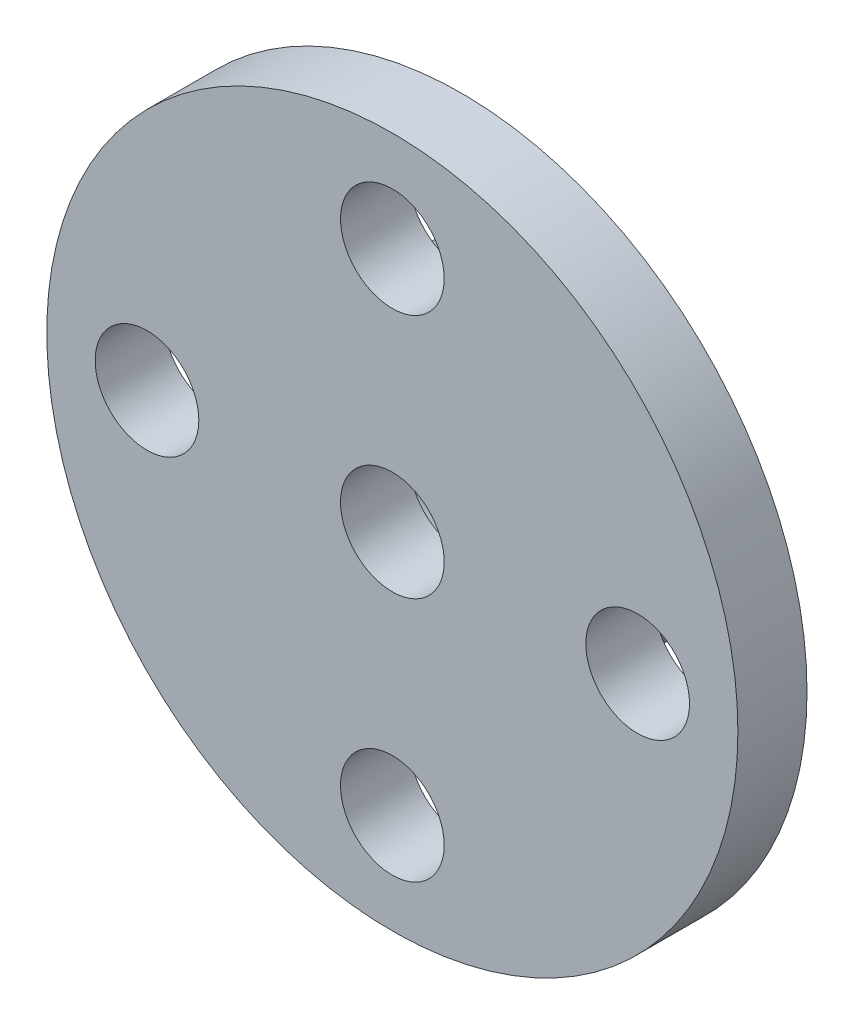
ISO-10303-21;
HEADER;
FILE_DESCRIPTION(('STEP AP214'),'2;1');
FILE_NAME('part.step','',(''),(''),'','','');
FILE_SCHEMA(('AUTOMOTIVE_DESIGN { 1 0 10303 214 1 1 1 1 }'));
ENDSEC;
DATA;
#1=APPLICATION_CONTEXT('core data for automotive mechanical design processes');
#2=APPLICATION_PROTOCOL_DEFINITION('international standard','automotive_design',2000,#1);
#3=PRODUCT_CONTEXT('',#1,'mechanical');
#4=PRODUCT('Part','Part','',(#3));
#5=PRODUCT_RELATED_PRODUCT_CATEGORY('part','',(#4));
#6=PRODUCT_DEFINITION_FORMATION('','',#4);
#7=PRODUCT_DEFINITION_CONTEXT('part definition',#1,'design');
#8=PRODUCT_DEFINITION('design','',#6,#7);
#9=PRODUCT_DEFINITION_SHAPE('','',#8);
#10=(LENGTH_UNIT() NAMED_UNIT(*) SI_UNIT(.MILLI.,.METRE.));
#11=(NAMED_UNIT(*) PLANE_ANGLE_UNIT() SI_UNIT($,.RADIAN.));
#12=(NAMED_UNIT(*) SI_UNIT($,.STERADIAN.) SOLID_ANGLE_UNIT());
#13=UNCERTAINTY_MEASURE_WITH_UNIT(LENGTH_MEASURE(1.E-05),#10,'distance_accuracy_value','');
#14=(GEOMETRIC_REPRESENTATION_CONTEXT(3) GLOBAL_UNCERTAINTY_ASSIGNED_CONTEXT((#13)) GLOBAL_UNIT_ASSIGNED_CONTEXT((#10,
#11,#12)) REPRESENTATION_CONTEXT('',''));
#15=CARTESIAN_POINT('',(0.,0.,0.));
#16=DIRECTION('',(0.,0.,1.));
#17=DIRECTION('',(1.,0.,0.));
#18=AXIS2_PLACEMENT_3D('',#15,#16,#17);
#19=CARTESIAN_POINT('',(0.,0.,-2.));
#20=DIRECTION('',(0.,0.,1.));
#21=DIRECTION('',(1.,0.,0.));
#22=AXIS2_PLACEMENT_3D('',#19,#20,#21);
#23=PLANE('',#22);
#24=CARTESIAN_POINT('',(0.,0.,-2.));
#25=DIRECTION('',(0.,0.,1.));
#26=DIRECTION('',(1.,0.,0.));
#27=AXIS2_PLACEMENT_3D('',#24,#25,#26);
#28=CIRCLE('',#27,1.5);
#29=CARTESIAN_POINT('',(1.5,0.,-2.));
#30=VERTEX_POINT('',#29);
#31=EDGE_CURVE('E49',#30,#30,#28,.F.);
#32=ORIENTED_EDGE('',*,*,#31,.F.);
#33=EDGE_LOOP('',(#32));
#34=FACE_BOUND('',#33,.T.);
#35=CARTESIAN_POINT('',(0.,0.,-2.));
#36=DIRECTION('',(0.,0.,-1.));
#37=DIRECTION('',(-1.,0.,0.));
#38=AXIS2_PLACEMENT_3D('',#35,#36,#37);
#39=CIRCLE('',#38,3.);
#40=CARTESIAN_POINT('',(-3.,0.,-2.));
#41=VERTEX_POINT('',#40);
#42=EDGE_CURVE('E84',#41,#41,#39,.T.);
#43=ORIENTED_EDGE('',*,*,#42,.T.);
#44=EDGE_LOOP('',(#43));
#45=FACE_BOUND('',#44,.T.);
#46=ADVANCED_FACE('F33',(#34,#45),#23,.F.);
#47=CARTESIAN_POINT('',(0.,0.,-2.));
#48=DIRECTION('',(0.,0.,1.));
#49=DIRECTION('',(1.,0.,0.));
#50=AXIS2_PLACEMENT_3D('',#47,#48,#49);
#51=CYLINDRICAL_SURFACE('',#50,10.);
#52=CARTESIAN_POINT('',(0.,0.,-2.));
#53=DIRECTION('',(0.,0.,1.));
#54=DIRECTION('',(1.,0.,0.));
#55=AXIS2_PLACEMENT_3D('',#52,#53,#54);
#56=CIRCLE('',#55,10.);
#57=CARTESIAN_POINT('',(10.,0.,-2.));
#58=VERTEX_POINT('',#57);
#59=EDGE_CURVE('E40',#58,#58,#56,.T.);
#60=ORIENTED_EDGE('',*,*,#59,.T.);
#61=EDGE_LOOP('',(#60));
#62=FACE_BOUND('',#61,.T.);
#63=CARTESIAN_POINT('',(0.,0.,0.));
#64=DIRECTION('',(0.,0.,1.));
#65=DIRECTION('',(1.,0.,0.));
#66=AXIS2_PLACEMENT_3D('',#63,#64,#65);
#67=CIRCLE('',#66,10.);
#68=CARTESIAN_POINT('',(10.,0.,0.));
#69=VERTEX_POINT('',#68);
#70=EDGE_CURVE('E44',#69,#69,#67,.T.);
#71=ORIENTED_EDGE('',*,*,#70,.F.);
#72=EDGE_LOOP('',(#71));
#73=FACE_BOUND('',#72,.T.);
#74=ADVANCED_FACE('F35',(#62,#73),#51,.T.);
#75=CARTESIAN_POINT('',(0.,0.,-2.));
#76=DIRECTION('',(0.,0.,1.));
#77=DIRECTION('',(1.,0.,0.));
#78=AXIS2_PLACEMENT_3D('',#75,#76,#77);
#79=CIRCLE('',#78,4.75);
#80=CARTESIAN_POINT('',(4.75,0.,-2.));
#81=VERTEX_POINT('',#80);
#82=EDGE_CURVE('E10',#81,#81,#79,.F.);
#83=ORIENTED_EDGE('',*,*,#82,.F.);
#84=EDGE_LOOP('',(#83));
#85=FACE_BOUND('',#84,.T.);
#86=CARTESIAN_POINT('',(0.,-7.1,-2.));
#87=DIRECTION('',(0.,0.,1.));
#88=DIRECTION('',(1.,0.,0.));
#89=AXIS2_PLACEMENT_3D('',#86,#87,#88);
#90=CIRCLE('',#89,1.50000000000002);
#91=CARTESIAN_POINT('',(1.50000000000002,-7.1,-2.));
#92=VERTEX_POINT('',#91);
#93=EDGE_CURVE('E69',#92,#92,#90,.F.);
#94=ORIENTED_EDGE('',*,*,#93,.F.);
#95=EDGE_LOOP('',(#94));
#96=FACE_BOUND('',#95,.T.);
#97=CARTESIAN_POINT('',(7.1,0.,-2.));
#98=DIRECTION('',(0.,0.,1.));
#99=DIRECTION('',(1.,0.,0.));
#100=AXIS2_PLACEMENT_3D('',#97,#98,#99);
#101=CIRCLE('',#100,1.5);
#102=CARTESIAN_POINT('',(8.6,0.,-2.));
#103=VERTEX_POINT('',#102);
#104=EDGE_CURVE('E64',#103,#103,#101,.F.);
#105=ORIENTED_EDGE('',*,*,#104,.F.);
#106=EDGE_LOOP('',(#105));
#107=FACE_BOUND('',#106,.T.);
#108=CARTESIAN_POINT('',(0.,7.1,-2.));
#109=DIRECTION('',(0.,0.,1.));
#110=DIRECTION('',(1.,0.,0.));
#111=AXIS2_PLACEMENT_3D('',#108,#109,#110);
#112=CIRCLE('',#111,1.50000000000001);
#113=CARTESIAN_POINT('',(1.50000000000001,7.1,-2.));
#114=VERTEX_POINT('',#113);
#115=EDGE_CURVE('E57',#114,#114,#112,.F.);
#116=ORIENTED_EDGE('',*,*,#115,.F.);
#117=EDGE_LOOP('',(#116));
#118=FACE_BOUND('',#117,.T.);
#119=CARTESIAN_POINT('',(-7.1,0.,-2.));
#120=DIRECTION('',(0.,0.,1.));
#121=DIRECTION('',(1.,0.,0.));
#122=AXIS2_PLACEMENT_3D('',#119,#120,#121);
#123=CIRCLE('',#122,1.5);
#124=CARTESIAN_POINT('',(-5.6,0.,-2.));
#125=VERTEX_POINT('',#124);
#126=EDGE_CURVE('E56',#125,#125,#123,.F.);
#127=ORIENTED_EDGE('',*,*,#126,.F.);
#128=EDGE_LOOP('',(#127));
#129=FACE_BOUND('',#128,.T.);
#130=ORIENTED_EDGE('',*,*,#59,.F.);
#131=EDGE_LOOP('',(#130));
#132=FACE_BOUND('',#131,.T.);
#133=ADVANCED_FACE('F112',(#85,#96,#107,#118,#129,#132),#23,.F.);
#134=CARTESIAN_POINT('',(0.,0.,0.));
#135=DIRECTION('',(0.,0.,1.));
#136=DIRECTION('',(1.,0.,0.));
#137=AXIS2_PLACEMENT_3D('',#134,#135,#136);
#138=PLANE('',#137);
#139=CARTESIAN_POINT('',(0.,-7.1,0.));
#140=DIRECTION('',(0.,0.,1.));
#141=DIRECTION('',(1.,0.,0.));
#142=AXIS2_PLACEMENT_3D('',#139,#140,#141);
#143=CIRCLE('',#142,1.50000000000002);
#144=CARTESIAN_POINT('',(1.50000000000002,-7.1,0.));
#145=VERTEX_POINT('',#144);
#146=EDGE_CURVE('E73',#145,#145,#143,.T.);
#147=ORIENTED_EDGE('',*,*,#146,.F.);
#148=EDGE_LOOP('',(#147));
#149=FACE_BOUND('',#148,.T.);
#150=CARTESIAN_POINT('',(7.1,0.,0.));
#151=DIRECTION('',(0.,0.,1.));
#152=DIRECTION('',(1.,0.,0.));
#153=AXIS2_PLACEMENT_3D('',#150,#151,#152);
#154=CIRCLE('',#153,1.5);
#155=CARTESIAN_POINT('',(8.6,0.,0.));
#156=VERTEX_POINT('',#155);
#157=EDGE_CURVE('E72',#156,#156,#154,.T.);
#158=ORIENTED_EDGE('',*,*,#157,.F.);
#159=EDGE_LOOP('',(#158));
#160=FACE_BOUND('',#159,.T.);
#161=CARTESIAN_POINT('',(0.,7.1,0.));
#162=DIRECTION('',(0.,0.,1.));
#163=DIRECTION('',(1.,0.,0.));
#164=AXIS2_PLACEMENT_3D('',#161,#162,#163);
#165=CIRCLE('',#164,1.50000000000001);
#166=CARTESIAN_POINT('',(1.50000000000001,7.1,0.));
#167=VERTEX_POINT('',#166);
#168=EDGE_CURVE('E61',#167,#167,#165,.T.);
#169=ORIENTED_EDGE('',*,*,#168,.F.);
#170=EDGE_LOOP('',(#169));
#171=FACE_BOUND('',#170,.T.);
#172=CARTESIAN_POINT('',(-7.1,0.,0.));
#173=DIRECTION('',(0.,0.,1.));
#174=DIRECTION('',(1.,0.,0.));
#175=AXIS2_PLACEMENT_3D('',#172,#173,#174);
#176=CIRCLE('',#175,1.5);
#177=CARTESIAN_POINT('',(-5.6,0.,0.));
#178=VERTEX_POINT('',#177);
#179=EDGE_CURVE('E60',#178,#178,#176,.T.);
#180=ORIENTED_EDGE('',*,*,#179,.F.);
#181=EDGE_LOOP('',(#180));
#182=FACE_BOUND('',#181,.T.);
#183=CARTESIAN_POINT('',(0.,0.,0.));
#184=DIRECTION('',(0.,0.,1.));
#185=DIRECTION('',(1.,0.,0.));
#186=AXIS2_PLACEMENT_3D('',#183,#184,#185);
#187=CIRCLE('',#186,1.5);
#188=CARTESIAN_POINT('',(1.5,0.,0.));
#189=VERTEX_POINT('',#188);
#190=EDGE_CURVE('E53',#189,#189,#187,.T.);
#191=ORIENTED_EDGE('',*,*,#190,.F.);
#192=EDGE_LOOP('',(#191));
#193=FACE_BOUND('',#192,.T.);
#194=ORIENTED_EDGE('',*,*,#70,.T.);
#195=EDGE_LOOP('',(#194));
#196=FACE_BOUND('',#195,.T.);
#197=ADVANCED_FACE('F120',(#149,#160,#171,#182,#193,#196),#138,.T.);
#198=CARTESIAN_POINT('',(0.,0.,-2.001));
#199=DIRECTION('',(0.,0.,1.));
#200=DIRECTION('',(1.,0.,0.));
#201=AXIS2_PLACEMENT_3D('',#198,#199,#200);
#202=CYLINDRICAL_SURFACE('',#201,1.5);
#203=ORIENTED_EDGE('',*,*,#190,.T.);
#204=EDGE_LOOP('',(#203));
#205=FACE_BOUND('',#204,.T.);
#206=ORIENTED_EDGE('',*,*,#31,.T.);
#207=EDGE_LOOP('',(#206));
#208=FACE_BOUND('',#207,.T.);
#209=ADVANCED_FACE('F125',(#205,#208),#202,.F.);
#210=CARTESIAN_POINT('',(-7.1,0.,-2.001));
#211=DIRECTION('',(0.,0.,1.));
#212=DIRECTION('',(1.,0.,0.));
#213=AXIS2_PLACEMENT_3D('',#210,#211,#212);
#214=CYLINDRICAL_SURFACE('',#213,1.5);
#215=ORIENTED_EDGE('',*,*,#179,.T.);
#216=EDGE_LOOP('',(#215));
#217=FACE_BOUND('',#216,.T.);
#218=ORIENTED_EDGE('',*,*,#126,.T.);
#219=EDGE_LOOP('',(#218));
#220=FACE_BOUND('',#219,.T.);
#221=ADVANCED_FACE('F137',(#217,#220),#214,.F.);
#222=CARTESIAN_POINT('',(0.,7.1,-2.001));
#223=DIRECTION('',(0.,0.,1.));
#224=DIRECTION('',(1.,0.,0.));
#225=AXIS2_PLACEMENT_3D('',#222,#223,#224);
#226=CYLINDRICAL_SURFACE('',#225,1.50000000000001);
#227=ORIENTED_EDGE('',*,*,#168,.T.);
#228=EDGE_LOOP('',(#227));
#229=FACE_BOUND('',#228,.T.);
#230=ORIENTED_EDGE('',*,*,#115,.T.);
#231=EDGE_LOOP('',(#230));
#232=FACE_BOUND('',#231,.T.);
#233=ADVANCED_FACE('F139',(#229,#232),#226,.F.);
#234=CARTESIAN_POINT('',(7.1,0.,-2.001));
#235=DIRECTION('',(0.,0.,1.));
#236=DIRECTION('',(1.,0.,0.));
#237=AXIS2_PLACEMENT_3D('',#234,#235,#236);
#238=CYLINDRICAL_SURFACE('',#237,1.5);
#239=ORIENTED_EDGE('',*,*,#157,.T.);
#240=EDGE_LOOP('',(#239));
#241=FACE_BOUND('',#240,.T.);
#242=ORIENTED_EDGE('',*,*,#104,.T.);
#243=EDGE_LOOP('',(#242));
#244=FACE_BOUND('',#243,.T.);
#245=ADVANCED_FACE('F105',(#241,#244),#238,.F.);
#246=CARTESIAN_POINT('',(0.,-7.1,-2.001));
#247=DIRECTION('',(0.,0.,1.));
#248=DIRECTION('',(1.,0.,0.));
#249=AXIS2_PLACEMENT_3D('',#246,#247,#248);
#250=CYLINDRICAL_SURFACE('',#249,1.50000000000002);
#251=ORIENTED_EDGE('',*,*,#146,.T.);
#252=EDGE_LOOP('',(#251));
#253=FACE_BOUND('',#252,.T.);
#254=ORIENTED_EDGE('',*,*,#93,.T.);
#255=EDGE_LOOP('',(#254));
#256=FACE_BOUND('',#255,.T.);
#257=ADVANCED_FACE('F96',(#253,#256),#250,.F.);
#258=CARTESIAN_POINT('',(0.,0.,-5.5));
#259=DIRECTION('',(0.,0.,-1.));
#260=DIRECTION('',(-1.,0.,0.));
#261=AXIS2_PLACEMENT_3D('',#258,#259,#260);
#262=PLANE('',#261);
#263=CARTESIAN_POINT('',(0.,0.,-5.5));
#264=DIRECTION('',(0.,0.,-1.));
#265=DIRECTION('',(-1.,0.,0.));
#266=AXIS2_PLACEMENT_3D('',#263,#264,#265);
#267=CIRCLE('',#266,4.75);
#268=CARTESIAN_POINT('',(-4.75,0.,-5.5));
#269=VERTEX_POINT('',#268);
#270=EDGE_CURVE('E76',#269,#269,#267,.T.);
#271=ORIENTED_EDGE('',*,*,#270,.T.);
#272=EDGE_LOOP('',(#271));
#273=FACE_BOUND('',#272,.T.);
#274=CARTESIAN_POINT('',(0.,0.,-5.5));
#275=DIRECTION('',(0.,0.,-1.));
#276=DIRECTION('',(-1.,0.,0.));
#277=AXIS2_PLACEMENT_3D('',#274,#275,#276);
#278=CIRCLE('',#277,3.);
#279=CARTESIAN_POINT('',(-3.,0.,-5.5));
#280=VERTEX_POINT('',#279);
#281=EDGE_CURVE('E83',#280,#280,#278,.T.);
#282=ORIENTED_EDGE('',*,*,#281,.F.);
#283=EDGE_LOOP('',(#282));
#284=FACE_BOUND('',#283,.T.);
#285=ADVANCED_FACE('F93',(#273,#284),#262,.T.);
#286=CARTESIAN_POINT('',(0.,0.,-5.5));
#287=DIRECTION('',(0.,0.,1.));
#288=DIRECTION('',(1.,0.,0.));
#289=AXIS2_PLACEMENT_3D('',#286,#287,#288);
#290=CYLINDRICAL_SURFACE('',#289,4.75);
#291=ORIENTED_EDGE('',*,*,#270,.F.);
#292=EDGE_LOOP('',(#291));
#293=FACE_BOUND('',#292,.T.);
#294=ORIENTED_EDGE('',*,*,#82,.T.);
#295=EDGE_LOOP('',(#294));
#296=FACE_BOUND('',#295,.T.);
#297=ADVANCED_FACE('F95',(#293,#296),#290,.T.);
#298=CARTESIAN_POINT('',(0.,0.,-5.5));
#299=DIRECTION('',(0.,0.,1.));
#300=DIRECTION('',(1.,0.,0.));
#301=AXIS2_PLACEMENT_3D('',#298,#299,#300);
#302=CYLINDRICAL_SURFACE('',#301,3.);
#303=ORIENTED_EDGE('',*,*,#281,.T.);
#304=EDGE_LOOP('',(#303));
#305=FACE_BOUND('',#304,.T.);
#306=ORIENTED_EDGE('',*,*,#42,.F.);
#307=EDGE_LOOP('',(#306));
#308=FACE_BOUND('',#307,.T.);
#309=ADVANCED_FACE('F90',(#305,#308),#302,.F.);
#310=CLOSED_SHELL('',(#46,#74,#133,#197,#209,#221,#233,#245,#257,#285,#297,#309));
#311=MANIFOLD_SOLID_BREP('B2',#310);
#312=ADVANCED_BREP_SHAPE_REPRESENTATION('',(#18,#311),#14);
#313=SHAPE_DEFINITION_REPRESENTATION(#9,#312);
ENDSEC;
END-ISO-10303-21;
